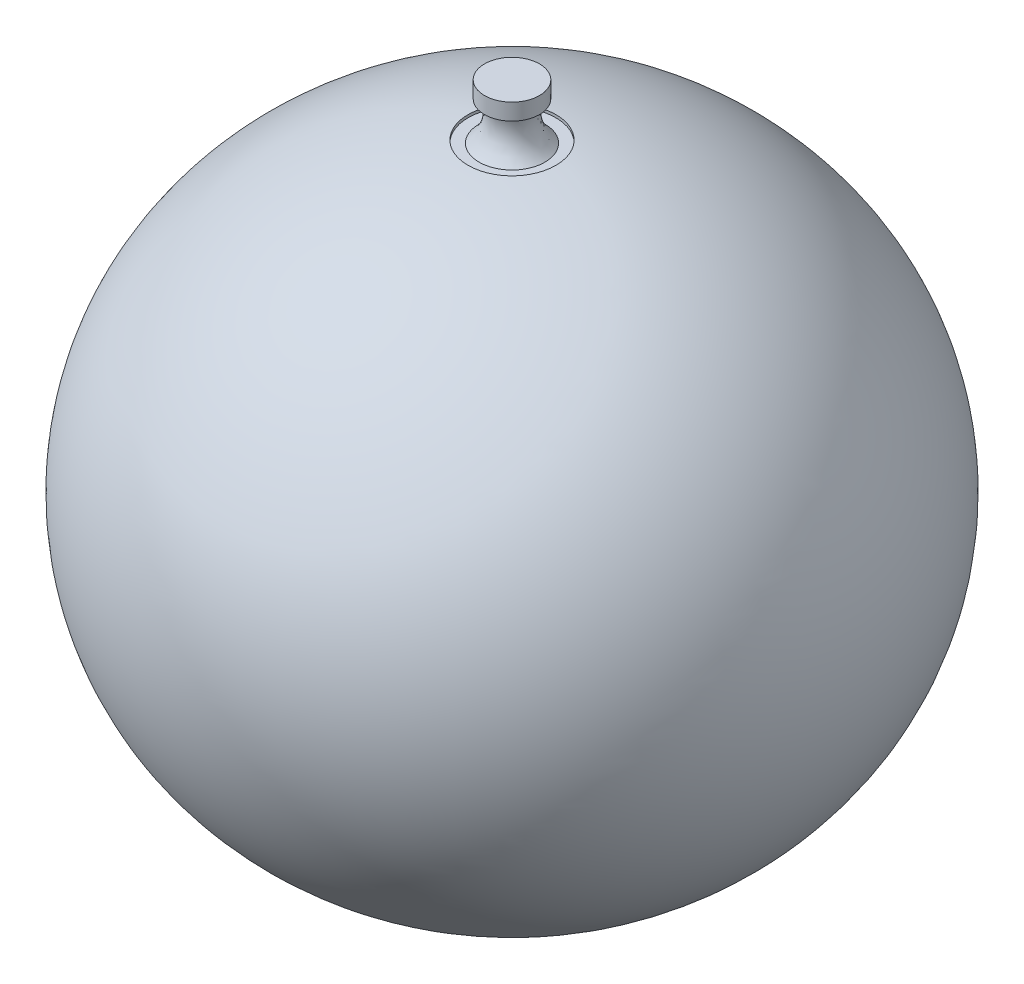
ISO-10303-21;
HEADER;
FILE_DESCRIPTION(('STEP AP214'),'2;1');
FILE_NAME('part.step','',(''),(''),'','','');
FILE_SCHEMA(('AUTOMOTIVE_DESIGN { 1 0 10303 214 1 1 1 1 }'));
ENDSEC;
DATA;
#1=APPLICATION_CONTEXT('core data for automotive mechanical design processes');
#2=APPLICATION_PROTOCOL_DEFINITION('international standard','automotive_design',2000,#1);
#3=PRODUCT_CONTEXT('',#1,'mechanical');
#4=PRODUCT('Part','Part','',(#3));
#5=PRODUCT_RELATED_PRODUCT_CATEGORY('part','',(#4));
#6=PRODUCT_DEFINITION_FORMATION('','',#4);
#7=PRODUCT_DEFINITION_CONTEXT('part definition',#1,'design');
#8=PRODUCT_DEFINITION('design','',#6,#7);
#9=PRODUCT_DEFINITION_SHAPE('','',#8);
#10=(LENGTH_UNIT() NAMED_UNIT(*) SI_UNIT(.MILLI.,.METRE.));
#11=(NAMED_UNIT(*) PLANE_ANGLE_UNIT() SI_UNIT($,.RADIAN.));
#12=(NAMED_UNIT(*) SI_UNIT($,.STERADIAN.) SOLID_ANGLE_UNIT());
#13=UNCERTAINTY_MEASURE_WITH_UNIT(LENGTH_MEASURE(1.E-05),#10,'distance_accuracy_value','');
#14=(GEOMETRIC_REPRESENTATION_CONTEXT(3) GLOBAL_UNCERTAINTY_ASSIGNED_CONTEXT((#13)) GLOBAL_UNIT_ASSIGNED_CONTEXT((#10,
#11,#12)) REPRESENTATION_CONTEXT('',''));
#15=CARTESIAN_POINT('',(0.,0.,0.));
#16=DIRECTION('',(0.,0.,1.));
#17=DIRECTION('',(1.,0.,0.));
#18=AXIS2_PLACEMENT_3D('',#15,#16,#17);
#19=CARTESIAN_POINT('',(0.,0.,0.));
#20=DIRECTION('',(0.,0.,1.));
#21=DIRECTION('',(1.,0.,0.));
#22=AXIS2_PLACEMENT_3D('',#19,#20,#21);
#23=ELLIPSE('',#22,30.,28.);
#24=TRIMMED_CURVE('',#23,(PARAMETER_VALUE(4.71238898038469)),
(PARAMETER_VALUE(7.85398163397448)),.T.,.PARAMETER.);
#25=CARTESIAN_POINT('',(0.,28.,0.));
#26=DIRECTION('',(0.,1.,0.));
#27=AXIS1_PLACEMENT('',#25,#26);
#28=SURFACE_OF_REVOLUTION('',#24,#27);
#29=CARTESIAN_POINT('',(0.,27.7499949949945,0.));
#30=DIRECTION('',(0.,1.,0.));
#31=DIRECTION('',(0.,0.,1.));
#32=AXIS2_PLACEMENT_3D('',#29,#30,#31);
#33=CIRCLE('',#32,4.);
#34=CARTESIAN_POINT('',(0.,27.7499949949945,4.));
#35=VERTEX_POINT('',#34);
#36=EDGE_CURVE('E47',#35,#35,#33,.F.);
#37=ORIENTED_EDGE('',*,*,#36,.T.);
#38=EDGE_LOOP('',(#37));
#39=FACE_BOUND('',#38,.T.);
#40=CARTESIAN_POINT('',(0.,-28.,0.));
#41=VERTEX_POINT('',#40);
#42=VERTEX_LOOP('',#41);
#43=FACE_BOUND('',#42,.T.);
#44=ADVANCED_FACE('F40',(#39,#43),#28,.T.);
#45=CARTESIAN_POINT('',(0.,27.5,0.));
#46=DIRECTION('',(0.,1.,0.));
#47=DIRECTION('',(0.,0.,1.));
#48=AXIS2_PLACEMENT_3D('',#45,#46,#47);
#49=CYLINDRICAL_SURFACE('',#48,4.);
#50=CARTESIAN_POINT('',(0.,27.5,0.));
#51=DIRECTION('',(0.,1.,0.));
#52=DIRECTION('',(0.,0.,1.));
#53=AXIS2_PLACEMENT_3D('',#50,#51,#52);
#54=CIRCLE('',#53,4.);
#55=CARTESIAN_POINT('',(0.,27.5,4.));
#56=VERTEX_POINT('',#55);
#57=EDGE_CURVE('E61',#56,#56,#54,.T.);
#58=ORIENTED_EDGE('',*,*,#57,.F.);
#59=EDGE_LOOP('',(#58));
#60=FACE_BOUND('',#59,.T.);
#61=ORIENTED_EDGE('',*,*,#36,.F.);
#62=EDGE_LOOP('',(#61));
#63=FACE_BOUND('',#62,.T.);
#64=ADVANCED_FACE('F51',(#60,#63),#49,.F.);
#65=CARTESIAN_POINT('',(0.,27.5,0.));
#66=DIRECTION('',(0.,1.,0.));
#67=DIRECTION('',(0.,0.,1.));
#68=AXIS2_PLACEMENT_3D('',#65,#66,#67);
#69=PLANE('',#68);
#70=CARTESIAN_POINT('',(0.,27.5,0.));
#71=DIRECTION('',(0.,-1.,0.));
#72=DIRECTION('',(0.,0.,-1.));
#73=AXIS2_PLACEMENT_3D('',#70,#71,#72);
#74=CIRCLE('',#73,3.);
#75=CARTESIAN_POINT('',(0.,27.5,-3.));
#76=VERTEX_POINT('',#75);
#77=EDGE_CURVE('E11',#76,#76,#74,.F.);
#78=ORIENTED_EDGE('',*,*,#77,.F.);
#79=EDGE_LOOP('',(#78));
#80=FACE_BOUND('',#79,.T.);
#81=ORIENTED_EDGE('',*,*,#57,.T.);
#82=EDGE_LOOP('',(#81));
#83=FACE_BOUND('',#82,.T.);
#84=ADVANCED_FACE('F56',(#80,#83),#69,.T.);
#85=CARTESIAN_POINT('',(0.,32.5,0.));
#86=DIRECTION('',(0.,1.,0.));
#87=DIRECTION('',(0.,0.,1.));
#88=AXIS2_PLACEMENT_3D('',#85,#86,#87);
#89=PLANE('',#88);
#90=CARTESIAN_POINT('',(0.,32.5,0.));
#91=DIRECTION('',(0.,-1.,0.));
#92=DIRECTION('',(0.,0.,-1.));
#93=AXIS2_PLACEMENT_3D('',#90,#91,#92);
#94=CIRCLE('',#93,2.5);
#95=CARTESIAN_POINT('',(0.,32.5,-2.5));
#96=VERTEX_POINT('',#95);
#97=EDGE_CURVE('E63',#96,#96,#94,.T.);
#98=ORIENTED_EDGE('',*,*,#97,.F.);
#99=EDGE_LOOP('',(#98));
#100=FACE_BOUND('',#99,.T.);
#101=ADVANCED_FACE('F95',(#100),#89,.T.);
#102=CARTESIAN_POINT('',(0.,27.5,0.));
#103=DIRECTION('',(0.,-1.,0.));
#104=DIRECTION('',(0.,0.,-1.));
#105=AXIS2_PLACEMENT_3D('',#102,#103,#104);
#106=CYLINDRICAL_SURFACE('',#105,2.5);
#107=ORIENTED_EDGE('',*,*,#97,.T.);
#108=EDGE_LOOP('',(#107));
#109=FACE_BOUND('',#108,.T.);
#110=CARTESIAN_POINT('',(0.,31.,0.));
#111=DIRECTION('',(0.,-1.,0.));
#112=DIRECTION('',(0.,0.,-1.));
#113=AXIS2_PLACEMENT_3D('',#110,#111,#112);
#114=CIRCLE('',#113,2.5);
#115=CARTESIAN_POINT('',(0.,31.,-2.5));
#116=VERTEX_POINT('',#115);
#117=EDGE_CURVE('E69',#116,#116,#114,.T.);
#118=ORIENTED_EDGE('',*,*,#117,.F.);
#119=EDGE_LOOP('',(#118));
#120=FACE_BOUND('',#119,.T.);
#121=ADVANCED_FACE('F91',(#109,#120),#106,.T.);
#122=CARTESIAN_POINT('',(2.5,31.,0.));
#123=DIRECTION('',(0.,-1.,0.));
#124=DIRECTION('',(0.,0.,-1.));
#125=AXIS2_PLACEMENT_3D('',#122,#123,#124);
#126=PLANE('',#125);
#127=ORIENTED_EDGE('',*,*,#117,.T.);
#128=EDGE_LOOP('',(#127));
#129=FACE_BOUND('',#128,.T.);
#130=CARTESIAN_POINT('',(0.,31.,0.));
#131=DIRECTION('',(0.,-1.,0.));
#132=DIRECTION('',(0.,0.,-1.));
#133=AXIS2_PLACEMENT_3D('',#130,#131,#132);
#134=CIRCLE('',#133,2.);
#135=CARTESIAN_POINT('',(0.,31.,-2.));
#136=VERTEX_POINT('',#135);
#137=EDGE_CURVE('E72',#136,#136,#134,.T.);
#138=ORIENTED_EDGE('',*,*,#137,.F.);
#139=EDGE_LOOP('',(#138));
#140=FACE_BOUND('',#139,.T.);
#141=ADVANCED_FACE('F86',(#129,#140),#126,.T.);
#142=CARTESIAN_POINT('',(3.,27.5,0.));
#143=CARTESIAN_POINT('',(1.42866774565796,28.9199989405991,0.));
#144=CARTESIAN_POINT('',(2.,31.,0.));
#145=B_SPLINE_CURVE_WITH_KNOTS('',2,(#142,#143,#144),.UNSPECIFIED.,.F.,.F.,(3,3),(0.,1.),.UNSPECIFIED.);
#146=CARTESIAN_POINT('',(0.,27.5,0.));
#147=DIRECTION('',(0.,-1.,0.));
#148=AXIS1_PLACEMENT('',#146,#147);
#149=SURFACE_OF_REVOLUTION('',#145,#148);
#150=ORIENTED_EDGE('',*,*,#137,.T.);
#151=EDGE_LOOP('',(#150));
#152=FACE_BOUND('',#151,.T.);
#153=ORIENTED_EDGE('',*,*,#77,.T.);
#154=EDGE_LOOP('',(#153));
#155=FACE_BOUND('',#154,.T.);
#156=ADVANCED_FACE('F82',(#152,#155),#149,.F.);
#157=CLOSED_SHELL('',(#44,#64,#84,#101,#121,#141,#156));
#158=CARTESIAN_POINT('',(0.,0.,0.));
#159=DIRECTION('',(0.,1.,0.));
#160=DIRECTION('',(1.,0.,0.));
#161=AXIS2_PLACEMENT_3D('',#158,#159,#160);
#162=SPHERICAL_SURFACE('',#161,20.);
#163=CARTESIAN_POINT('',(0.,20.,0.));
#164=VERTEX_POINT('',#163);
#165=VERTEX_LOOP('',#164);
#166=FACE_BOUND('',#165,.T.);
#167=ADVANCED_FACE('F88',(#166),#162,.F.);
#168=CLOSED_SHELL('',(#167));
#169=ORIENTED_CLOSED_SHELL('',*,#168,.T.);
#170=BREP_WITH_VOIDS('B2',#157,(#169));
#171=ADVANCED_BREP_SHAPE_REPRESENTATION('',(#18,#170),#14);
#172=SHAPE_DEFINITION_REPRESENTATION(#9,#171);
ENDSEC;
END-ISO-10303-21;
